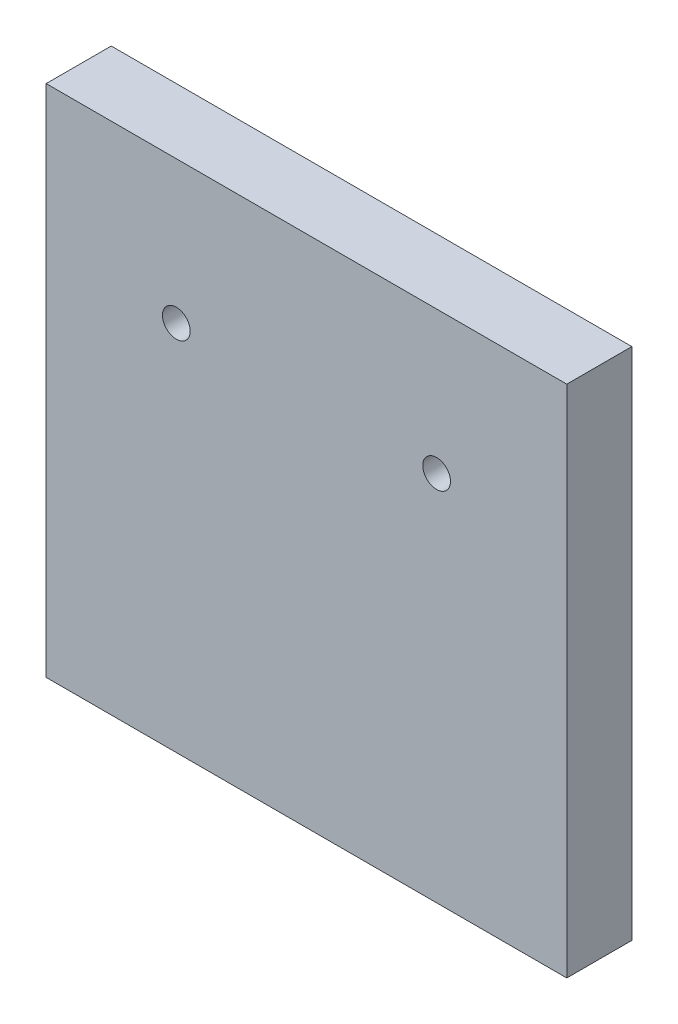
ISO-10303-21;
HEADER;
FILE_DESCRIPTION(('STEP AP214'),'2;1');
FILE_NAME('part.step','',(''),(''),'','','');
FILE_SCHEMA(('AUTOMOTIVE_DESIGN { 1 0 10303 214 1 1 1 1 }'));
ENDSEC;
DATA;
#1=APPLICATION_CONTEXT('core data for automotive mechanical design processes');
#2=APPLICATION_PROTOCOL_DEFINITION('international standard','automotive_design',2000,#1);
#3=PRODUCT_CONTEXT('',#1,'mechanical');
#4=PRODUCT('Part','Part','',(#3));
#5=PRODUCT_RELATED_PRODUCT_CATEGORY('part','',(#4));
#6=PRODUCT_DEFINITION_FORMATION('','',#4);
#7=PRODUCT_DEFINITION_CONTEXT('part definition',#1,'design');
#8=PRODUCT_DEFINITION('design','',#6,#7);
#9=PRODUCT_DEFINITION_SHAPE('','',#8);
#10=(LENGTH_UNIT() NAMED_UNIT(*) SI_UNIT(.MILLI.,.METRE.));
#11=(NAMED_UNIT(*) PLANE_ANGLE_UNIT() SI_UNIT($,.RADIAN.));
#12=(NAMED_UNIT(*) SI_UNIT($,.STERADIAN.) SOLID_ANGLE_UNIT());
#13=UNCERTAINTY_MEASURE_WITH_UNIT(LENGTH_MEASURE(1.E-05),#10,'distance_accuracy_value','');
#14=(GEOMETRIC_REPRESENTATION_CONTEXT(3) GLOBAL_UNCERTAINTY_ASSIGNED_CONTEXT((#13)) GLOBAL_UNIT_ASSIGNED_CONTEXT((#10,
#11,#12)) REPRESENTATION_CONTEXT('',''));
#15=CARTESIAN_POINT('',(0.,0.,0.));
#16=DIRECTION('',(0.,0.,1.));
#17=DIRECTION('',(1.,0.,0.));
#18=AXIS2_PLACEMENT_3D('',#15,#16,#17);
#19=CARTESIAN_POINT('',(25.4,13.9,6.35));
#20=DIRECTION('',(0.,-1.,0.));
#21=DIRECTION('',(0.,0.,-1.));
#22=AXIS2_PLACEMENT_3D('',#19,#20,#21);
#23=PLANE('',#22);
#24=DIRECTION('',(-1.,0.,0.));
#25=VECTOR('',#24,1.);
#26=CARTESIAN_POINT('',(25.4,13.9,0.));
#27=LINE('',#26,#25);
#28=CARTESIAN_POINT('',(25.4,13.9,0.));
#29=VERTEX_POINT('',#28);
#30=CARTESIAN_POINT('',(-25.4,13.9,0.));
#31=VERTEX_POINT('',#30);
#32=EDGE_CURVE('E98',#29,#31,#27,.T.);
#33=ORIENTED_EDGE('',*,*,#32,.T.);
#34=DIRECTION('',(0.,0.,-1.));
#35=VECTOR('',#34,1.);
#36=CARTESIAN_POINT('',(-25.4,13.9,6.35));
#37=LINE('',#36,#35);
#38=CARTESIAN_POINT('',(-25.4,13.9,6.35));
#39=VERTEX_POINT('',#38);
#40=EDGE_CURVE('E11',#39,#31,#37,.T.);
#41=ORIENTED_EDGE('',*,*,#40,.F.);
#42=DIRECTION('',(-1.,0.,0.));
#43=VECTOR('',#42,1.);
#44=CARTESIAN_POINT('',(25.4,13.9,6.35));
#45=LINE('',#44,#43);
#46=CARTESIAN_POINT('',(25.4,13.9,6.35));
#47=VERTEX_POINT('',#46);
#48=EDGE_CURVE('E84',#47,#39,#45,.T.);
#49=ORIENTED_EDGE('',*,*,#48,.F.);
#50=DIRECTION('',(0.,0.,-1.));
#51=VECTOR('',#50,1.);
#52=CARTESIAN_POINT('',(25.4,13.9,6.35));
#53=LINE('',#52,#51);
#54=EDGE_CURVE('E51',#47,#29,#53,.T.);
#55=ORIENTED_EDGE('',*,*,#54,.T.);
#56=EDGE_LOOP('',(#33,#41,#49,#55));
#57=FACE_BOUND('',#56,.T.);
#58=ADVANCED_FACE('F35',(#57),#23,.F.);
#59=CARTESIAN_POINT('',(-25.4,13.9,6.35));
#60=DIRECTION('',(1.,0.,0.));
#61=DIRECTION('',(0.,1.,0.));
#62=AXIS2_PLACEMENT_3D('',#59,#60,#61);
#63=PLANE('',#62);
#64=DIRECTION('',(0.,-1.,0.));
#65=VECTOR('',#64,1.);
#66=CARTESIAN_POINT('',(-25.4,13.9,0.));
#67=LINE('',#66,#65);
#68=CARTESIAN_POINT('',(-25.4,-36.2842219807007,0.));
#69=VERTEX_POINT('',#68);
#70=EDGE_CURVE('E89',#31,#69,#67,.T.);
#71=ORIENTED_EDGE('',*,*,#70,.T.);
#72=DIRECTION('',(0.,0.,-1.));
#73=VECTOR('',#72,1.);
#74=CARTESIAN_POINT('',(-25.4,-36.2842219807007,6.35));
#75=LINE('',#74,#73);
#76=CARTESIAN_POINT('',(-25.4,-36.2842219807007,6.35));
#77=VERTEX_POINT('',#76);
#78=EDGE_CURVE('E43',#77,#69,#75,.T.);
#79=ORIENTED_EDGE('',*,*,#78,.F.);
#80=DIRECTION('',(0.,-1.,0.));
#81=VECTOR('',#80,1.);
#82=CARTESIAN_POINT('',(-25.4,13.9,6.35));
#83=LINE('',#82,#81);
#84=EDGE_CURVE('E76',#39,#77,#83,.T.);
#85=ORIENTED_EDGE('',*,*,#84,.F.);
#86=ORIENTED_EDGE('',*,*,#40,.T.);
#87=EDGE_LOOP('',(#71,#79,#85,#86));
#88=FACE_BOUND('',#87,.T.);
#89=ADVANCED_FACE('F88',(#88),#63,.F.);
#90=CARTESIAN_POINT('',(25.4,-36.2842219807007,6.35));
#91=DIRECTION('',(0.,-1.,0.));
#92=DIRECTION('',(0.,0.,-1.));
#93=AXIS2_PLACEMENT_3D('',#90,#91,#92);
#94=PLANE('',#93);
#95=DIRECTION('',(-1.,0.,0.));
#96=VECTOR('',#95,1.);
#97=CARTESIAN_POINT('',(25.4,-36.2842219807007,0.));
#98=LINE('',#97,#96);
#99=CARTESIAN_POINT('',(25.4,-36.2842219807007,0.));
#100=VERTEX_POINT('',#99);
#101=EDGE_CURVE('E102',#100,#69,#98,.T.);
#102=ORIENTED_EDGE('',*,*,#101,.F.);
#103=DIRECTION('',(0.,0.,-1.));
#104=VECTOR('',#103,1.);
#105=CARTESIAN_POINT('',(25.4,-36.2842219807007,6.35));
#106=LINE('',#105,#104);
#107=CARTESIAN_POINT('',(25.4,-36.2842219807007,6.35));
#108=VERTEX_POINT('',#107);
#109=EDGE_CURVE('E65',#108,#100,#106,.T.);
#110=ORIENTED_EDGE('',*,*,#109,.F.);
#111=DIRECTION('',(-1.,0.,0.));
#112=VECTOR('',#111,1.);
#113=CARTESIAN_POINT('',(25.4,-36.2842219807007,6.35));
#114=LINE('',#113,#112);
#115=EDGE_CURVE('E83',#108,#77,#114,.T.);
#116=ORIENTED_EDGE('',*,*,#115,.T.);
#117=ORIENTED_EDGE('',*,*,#78,.T.);
#118=EDGE_LOOP('',(#102,#110,#116,#117));
#119=FACE_BOUND('',#118,.T.);
#120=ADVANCED_FACE('F92',(#119),#94,.T.);
#121=CARTESIAN_POINT('',(25.4,13.9,6.35));
#122=DIRECTION('',(1.,0.,0.));
#123=DIRECTION('',(0.,1.,0.));
#124=AXIS2_PLACEMENT_3D('',#121,#122,#123);
#125=PLANE('',#124);
#126=DIRECTION('',(0.,-1.,0.));
#127=VECTOR('',#126,1.);
#128=CARTESIAN_POINT('',(25.4,13.9,0.));
#129=LINE('',#128,#127);
#130=EDGE_CURVE('E104',#29,#100,#129,.T.);
#131=ORIENTED_EDGE('',*,*,#130,.F.);
#132=ORIENTED_EDGE('',*,*,#54,.F.);
#133=DIRECTION('',(0.,-1.,0.));
#134=VECTOR('',#133,1.);
#135=CARTESIAN_POINT('',(25.4,13.9,6.35));
#136=LINE('',#135,#134);
#137=EDGE_CURVE('E93',#47,#108,#136,.T.);
#138=ORIENTED_EDGE('',*,*,#137,.T.);
#139=ORIENTED_EDGE('',*,*,#109,.T.);
#140=EDGE_LOOP('',(#131,#132,#138,#139));
#141=FACE_BOUND('',#140,.T.);
#142=ADVANCED_FACE('F130',(#141),#125,.T.);
#143=CARTESIAN_POINT('',(0.,0.,6.35));
#144=DIRECTION('',(0.,0.,1.));
#145=DIRECTION('',(1.,0.,0.));
#146=AXIS2_PLACEMENT_3D('',#143,#144,#145);
#147=PLANE('',#146);
#148=CARTESIAN_POINT('',(12.7,0.,6.35));
#149=DIRECTION('',(0.,0.,-1.));
#150=DIRECTION('',(-1.,0.,0.));
#151=AXIS2_PLACEMENT_3D('',#148,#149,#150);
#152=CIRCLE('',#151,1.35255);
#153=CARTESIAN_POINT('',(11.34745,0.,6.35));
#154=VERTEX_POINT('',#153);
#155=EDGE_CURVE('E115',#154,#154,#152,.T.);
#156=ORIENTED_EDGE('',*,*,#155,.T.);
#157=EDGE_LOOP('',(#156));
#158=FACE_BOUND('',#157,.T.);
#159=CARTESIAN_POINT('',(-12.7,0.,6.35));
#160=DIRECTION('',(0.,0.,-1.));
#161=DIRECTION('',(-1.,0.,0.));
#162=AXIS2_PLACEMENT_3D('',#159,#160,#161);
#163=CIRCLE('',#162,1.35255);
#164=CARTESIAN_POINT('',(-14.05255,0.,6.35));
#165=VERTEX_POINT('',#164);
#166=EDGE_CURVE('E100',#165,#165,#163,.T.);
#167=ORIENTED_EDGE('',*,*,#166,.T.);
#168=EDGE_LOOP('',(#167));
#169=FACE_BOUND('',#168,.T.);
#170=ORIENTED_EDGE('',*,*,#48,.T.);
#171=ORIENTED_EDGE('',*,*,#84,.T.);
#172=ORIENTED_EDGE('',*,*,#115,.F.);
#173=ORIENTED_EDGE('',*,*,#137,.F.);
#174=EDGE_LOOP('',(#170,#171,#172,#173));
#175=FACE_BOUND('',#174,.T.);
#176=ADVANCED_FACE('F80',(#158,#169,#175),#147,.T.);
#177=CARTESIAN_POINT('',(0.,0.,0.));
#178=DIRECTION('',(0.,0.,1.));
#179=DIRECTION('',(1.,0.,0.));
#180=AXIS2_PLACEMENT_3D('',#177,#178,#179);
#181=PLANE('',#180);
#182=CARTESIAN_POINT('',(12.7,0.,0.));
#183=DIRECTION('',(0.,0.,-1.));
#184=DIRECTION('',(-1.,0.,0.));
#185=AXIS2_PLACEMENT_3D('',#182,#183,#184);
#186=CIRCLE('',#185,1.35255);
#187=CARTESIAN_POINT('',(11.34745,0.,0.));
#188=VERTEX_POINT('',#187);
#189=EDGE_CURVE('E118',#188,#188,#186,.T.);
#190=ORIENTED_EDGE('',*,*,#189,.F.);
#191=EDGE_LOOP('',(#190));
#192=FACE_BOUND('',#191,.T.);
#193=CARTESIAN_POINT('',(-12.7,0.,0.));
#194=DIRECTION('',(0.,0.,-1.));
#195=DIRECTION('',(-1.,0.,0.));
#196=AXIS2_PLACEMENT_3D('',#193,#194,#195);
#197=CIRCLE('',#196,1.35255);
#198=CARTESIAN_POINT('',(-14.05255,0.,0.));
#199=VERTEX_POINT('',#198);
#200=EDGE_CURVE('E112',#199,#199,#197,.T.);
#201=ORIENTED_EDGE('',*,*,#200,.F.);
#202=EDGE_LOOP('',(#201));
#203=FACE_BOUND('',#202,.T.);
#204=ORIENTED_EDGE('',*,*,#32,.F.);
#205=ORIENTED_EDGE('',*,*,#130,.T.);
#206=ORIENTED_EDGE('',*,*,#101,.T.);
#207=ORIENTED_EDGE('',*,*,#70,.F.);
#208=EDGE_LOOP('',(#204,#205,#206,#207));
#209=FACE_BOUND('',#208,.T.);
#210=ADVANCED_FACE('F124',(#192,#203,#209),#181,.F.);
#211=CARTESIAN_POINT('',(-12.7,0.,0.));
#212=DIRECTION('',(0.,0.,-1.));
#213=DIRECTION('',(-1.,0.,0.));
#214=AXIS2_PLACEMENT_3D('',#211,#212,#213);
#215=CYLINDRICAL_SURFACE('',#214,1.35255);
#216=ORIENTED_EDGE('',*,*,#166,.F.);
#217=EDGE_LOOP('',(#216));
#218=FACE_BOUND('',#217,.T.);
#219=ORIENTED_EDGE('',*,*,#200,.T.);
#220=EDGE_LOOP('',(#219));
#221=FACE_BOUND('',#220,.T.);
#222=ADVANCED_FACE('F127',(#218,#221),#215,.F.);
#223=CARTESIAN_POINT('',(12.7,0.,0.));
#224=DIRECTION('',(0.,0.,-1.));
#225=DIRECTION('',(-1.,0.,0.));
#226=AXIS2_PLACEMENT_3D('',#223,#224,#225);
#227=CYLINDRICAL_SURFACE('',#226,1.35255);
#228=ORIENTED_EDGE('',*,*,#155,.F.);
#229=EDGE_LOOP('',(#228));
#230=FACE_BOUND('',#229,.T.);
#231=ORIENTED_EDGE('',*,*,#189,.T.);
#232=EDGE_LOOP('',(#231));
#233=FACE_BOUND('',#232,.T.);
#234=ADVANCED_FACE('F122',(#230,#233),#227,.F.);
#235=CLOSED_SHELL('',(#58,#89,#120,#142,#176,#210,#222,#234));
#236=MANIFOLD_SOLID_BREP('B2',#235);
#237=ADVANCED_BREP_SHAPE_REPRESENTATION('',(#18,#236),#14);
#238=SHAPE_DEFINITION_REPRESENTATION(#9,#237);
ENDSEC;
END-ISO-10303-21;
